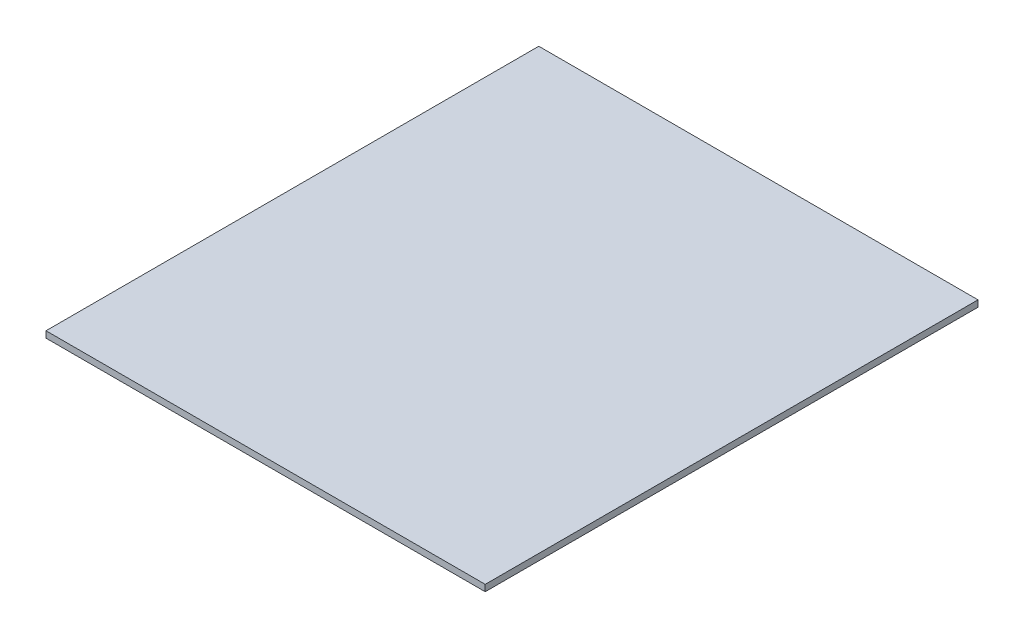
ISO-10303-21;
HEADER;
FILE_DESCRIPTION(('STEP AP214'),'2;1');
FILE_NAME('part.step','',(''),(''),'','','');
FILE_SCHEMA(('AUTOMOTIVE_DESIGN { 1 0 10303 214 1 1 1 1 }'));
ENDSEC;
DATA;
#1=APPLICATION_CONTEXT('core data for automotive mechanical design processes');
#2=APPLICATION_PROTOCOL_DEFINITION('international standard','automotive_design',2000,#1);
#3=PRODUCT_CONTEXT('',#1,'mechanical');
#4=PRODUCT('Part','Part','',(#3));
#5=PRODUCT_RELATED_PRODUCT_CATEGORY('part','',(#4));
#6=PRODUCT_DEFINITION_FORMATION('','',#4);
#7=PRODUCT_DEFINITION_CONTEXT('part definition',#1,'design');
#8=PRODUCT_DEFINITION('design','',#6,#7);
#9=PRODUCT_DEFINITION_SHAPE('','',#8);
#10=(LENGTH_UNIT() NAMED_UNIT(*) SI_UNIT(.MILLI.,.METRE.));
#11=(NAMED_UNIT(*) PLANE_ANGLE_UNIT() SI_UNIT($,.RADIAN.));
#12=(NAMED_UNIT(*) SI_UNIT($,.STERADIAN.) SOLID_ANGLE_UNIT());
#13=UNCERTAINTY_MEASURE_WITH_UNIT(LENGTH_MEASURE(1.E-05),#10,'distance_accuracy_value','');
#14=(GEOMETRIC_REPRESENTATION_CONTEXT(3) GLOBAL_UNCERTAINTY_ASSIGNED_CONTEXT((#13)) GLOBAL_UNIT_ASSIGNED_CONTEXT((#10,
#11,#12)) REPRESENTATION_CONTEXT('',''));
#15=CARTESIAN_POINT('',(0.,0.,0.));
#16=DIRECTION('',(0.,0.,1.));
#17=DIRECTION('',(1.,0.,0.));
#18=AXIS2_PLACEMENT_3D('',#15,#16,#17);
#19=CARTESIAN_POINT('',(-205.,6.,230.));
#20=DIRECTION('',(1.,0.,0.));
#21=DIRECTION('',(0.,0.,-1.));
#22=AXIS2_PLACEMENT_3D('',#19,#20,#21);
#23=PLANE('',#22);
#24=DIRECTION('',(0.,0.,1.));
#25=VECTOR('',#24,1.);
#26=CARTESIAN_POINT('',(-205.,0.,230.));
#27=LINE('',#26,#25);
#28=CARTESIAN_POINT('',(-205.,0.,-230.));
#29=VERTEX_POINT('',#28);
#30=CARTESIAN_POINT('',(-205.,0.,230.));
#31=VERTEX_POINT('',#30);
#32=EDGE_CURVE('E115',#29,#31,#27,.T.);
#33=ORIENTED_EDGE('',*,*,#32,.T.);
#34=DIRECTION('',(0.,-1.,0.));
#35=VECTOR('',#34,1.);
#36=CARTESIAN_POINT('',(-205.,6.,230.));
#37=LINE('',#36,#35);
#38=CARTESIAN_POINT('',(-205.,6.,230.));
#39=VERTEX_POINT('',#38);
#40=EDGE_CURVE('E11',#39,#31,#37,.T.);
#41=ORIENTED_EDGE('',*,*,#40,.F.);
#42=DIRECTION('',(0.,0.,1.));
#43=VECTOR('',#42,1.);
#44=CARTESIAN_POINT('',(-205.,6.,230.));
#45=LINE('',#44,#43);
#46=CARTESIAN_POINT('',(-205.,6.,-230.));
#47=VERTEX_POINT('',#46);
#48=EDGE_CURVE('E92',#47,#39,#45,.T.);
#49=ORIENTED_EDGE('',*,*,#48,.F.);
#50=DIRECTION('',(0.,-1.,0.));
#51=VECTOR('',#50,1.);
#52=CARTESIAN_POINT('',(-205.,6.,-230.));
#53=LINE('',#52,#51);
#54=EDGE_CURVE('E107',#47,#29,#53,.T.);
#55=ORIENTED_EDGE('',*,*,#54,.T.);
#56=EDGE_LOOP('',(#33,#41,#49,#55));
#57=FACE_BOUND('',#56,.T.);
#58=ADVANCED_FACE('F43',(#57),#23,.F.);
#59=CARTESIAN_POINT('',(-205.,6.,230.));
#60=DIRECTION('',(0.,0.,-1.));
#61=DIRECTION('',(-1.,0.,0.));
#62=AXIS2_PLACEMENT_3D('',#59,#60,#61);
#63=PLANE('',#62);
#64=DIRECTION('',(1.,0.,0.));
#65=VECTOR('',#64,1.);
#66=CARTESIAN_POINT('',(-205.,0.,230.));
#67=LINE('',#66,#65);
#68=CARTESIAN_POINT('',(205.,0.,230.));
#69=VERTEX_POINT('',#68);
#70=EDGE_CURVE('E99',#31,#69,#67,.T.);
#71=ORIENTED_EDGE('',*,*,#70,.T.);
#72=DIRECTION('',(0.,-1.,0.));
#73=VECTOR('',#72,1.);
#74=CARTESIAN_POINT('',(205.,6.,230.));
#75=LINE('',#74,#73);
#76=CARTESIAN_POINT('',(205.,6.,230.));
#77=VERTEX_POINT('',#76);
#78=EDGE_CURVE('E55',#77,#69,#75,.T.);
#79=ORIENTED_EDGE('',*,*,#78,.F.);
#80=DIRECTION('',(1.,0.,0.));
#81=VECTOR('',#80,1.);
#82=CARTESIAN_POINT('',(-205.,6.,230.));
#83=LINE('',#82,#81);
#84=EDGE_CURVE('E89',#39,#77,#83,.T.);
#85=ORIENTED_EDGE('',*,*,#84,.F.);
#86=ORIENTED_EDGE('',*,*,#40,.T.);
#87=EDGE_LOOP('',(#71,#79,#85,#86));
#88=FACE_BOUND('',#87,.T.);
#89=ADVANCED_FACE('F97',(#88),#63,.F.);
#90=CARTESIAN_POINT('',(205.,6.,230.));
#91=DIRECTION('',(-1.,0.,0.));
#92=DIRECTION('',(0.,0.,1.));
#93=AXIS2_PLACEMENT_3D('',#90,#91,#92);
#94=PLANE('',#93);
#95=DIRECTION('',(0.,0.,-1.));
#96=VECTOR('',#95,1.);
#97=CARTESIAN_POINT('',(205.,0.,230.));
#98=LINE('',#97,#96);
#99=CARTESIAN_POINT('',(205.,0.,-230.));
#100=VERTEX_POINT('',#99);
#101=EDGE_CURVE('E76',#69,#100,#98,.T.);
#102=ORIENTED_EDGE('',*,*,#101,.T.);
#103=DIRECTION('',(0.,-1.,0.));
#104=VECTOR('',#103,1.);
#105=CARTESIAN_POINT('',(205.,6.,-230.));
#106=LINE('',#105,#104);
#107=CARTESIAN_POINT('',(205.,6.,-230.));
#108=VERTEX_POINT('',#107);
#109=EDGE_CURVE('E105',#108,#100,#106,.T.);
#110=ORIENTED_EDGE('',*,*,#109,.F.);
#111=DIRECTION('',(0.,0.,-1.));
#112=VECTOR('',#111,1.);
#113=CARTESIAN_POINT('',(205.,6.,230.));
#114=LINE('',#113,#112);
#115=EDGE_CURVE('E91',#77,#108,#114,.T.);
#116=ORIENTED_EDGE('',*,*,#115,.F.);
#117=ORIENTED_EDGE('',*,*,#78,.T.);
#118=EDGE_LOOP('',(#102,#110,#116,#117));
#119=FACE_BOUND('',#118,.T.);
#120=ADVANCED_FACE('F103',(#119),#94,.F.);
#121=CARTESIAN_POINT('',(-205.,6.,-230.));
#122=DIRECTION('',(0.,0.,1.));
#123=DIRECTION('',(1.,0.,0.));
#124=AXIS2_PLACEMENT_3D('',#121,#122,#123);
#125=PLANE('',#124);
#126=DIRECTION('',(-1.,0.,0.));
#127=VECTOR('',#126,1.);
#128=CARTESIAN_POINT('',(-205.,0.,-230.));
#129=LINE('',#128,#127);
#130=EDGE_CURVE('E82',#100,#29,#129,.T.);
#131=ORIENTED_EDGE('',*,*,#130,.T.);
#132=ORIENTED_EDGE('',*,*,#54,.F.);
#133=DIRECTION('',(-1.,0.,0.));
#134=VECTOR('',#133,1.);
#135=CARTESIAN_POINT('',(-205.,6.,-230.));
#136=LINE('',#135,#134);
#137=EDGE_CURVE('E58',#108,#47,#136,.T.);
#138=ORIENTED_EDGE('',*,*,#137,.F.);
#139=ORIENTED_EDGE('',*,*,#109,.T.);
#140=EDGE_LOOP('',(#131,#132,#138,#139));
#141=FACE_BOUND('',#140,.T.);
#142=ADVANCED_FACE('F123',(#141),#125,.F.);
#143=CARTESIAN_POINT('',(0.,6.,0.));
#144=DIRECTION('',(0.,-1.,0.));
#145=DIRECTION('',(0.,0.,-1.));
#146=AXIS2_PLACEMENT_3D('',#143,#144,#145);
#147=PLANE('',#146);
#148=ORIENTED_EDGE('',*,*,#48,.T.);
#149=ORIENTED_EDGE('',*,*,#84,.T.);
#150=ORIENTED_EDGE('',*,*,#115,.T.);
#151=ORIENTED_EDGE('',*,*,#137,.T.);
#152=EDGE_LOOP('',(#148,#149,#150,#151));
#153=FACE_BOUND('',#152,.T.);
#154=ADVANCED_FACE('F93',(#153),#147,.F.);
#155=CARTESIAN_POINT('',(0.,0.,0.));
#156=DIRECTION('',(0.,-1.,0.));
#157=DIRECTION('',(0.,0.,-1.));
#158=AXIS2_PLACEMENT_3D('',#155,#156,#157);
#159=PLANE('',#158);
#160=ORIENTED_EDGE('',*,*,#32,.F.);
#161=ORIENTED_EDGE('',*,*,#130,.F.);
#162=ORIENTED_EDGE('',*,*,#101,.F.);
#163=ORIENTED_EDGE('',*,*,#70,.F.);
#164=EDGE_LOOP('',(#160,#161,#162,#163));
#165=FACE_BOUND('',#164,.T.);
#166=ADVANCED_FACE('F130',(#165),#159,.T.);
#167=CLOSED_SHELL('',(#58,#89,#120,#142,#154,#166));
#168=MANIFOLD_SOLID_BREP('B2',#167);
#169=ADVANCED_BREP_SHAPE_REPRESENTATION('',(#18,#168),#14);
#170=SHAPE_DEFINITION_REPRESENTATION(#9,#169);
ENDSEC;
END-ISO-10303-21;
